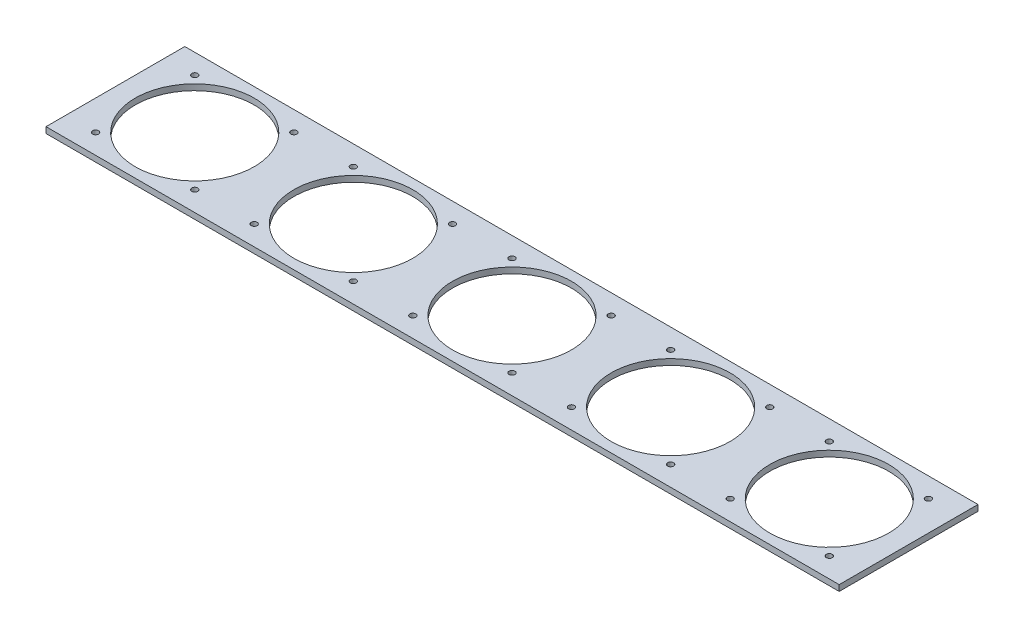
ISO-10303-21;
HEADER;
FILE_DESCRIPTION(('STEP AP214'),'2;1');
FILE_NAME('part.step','',(''),(''),'','','');
FILE_SCHEMA(('AUTOMOTIVE_DESIGN { 1 0 10303 214 1 1 1 1 }'));
ENDSEC;
DATA;
#1=APPLICATION_CONTEXT('core data for automotive mechanical design processes');
#2=APPLICATION_PROTOCOL_DEFINITION('international standard','automotive_design',2000,#1);
#3=PRODUCT_CONTEXT('',#1,'mechanical');
#4=PRODUCT('Part','Part','',(#3));
#5=PRODUCT_RELATED_PRODUCT_CATEGORY('part','',(#4));
#6=PRODUCT_DEFINITION_FORMATION('','',#4);
#7=PRODUCT_DEFINITION_CONTEXT('part definition',#1,'design');
#8=PRODUCT_DEFINITION('design','',#6,#7);
#9=PRODUCT_DEFINITION_SHAPE('','',#8);
#10=(LENGTH_UNIT() NAMED_UNIT(*) SI_UNIT(.MILLI.,.METRE.));
#11=(NAMED_UNIT(*) PLANE_ANGLE_UNIT() SI_UNIT($,.RADIAN.));
#12=(NAMED_UNIT(*) SI_UNIT($,.STERADIAN.) SOLID_ANGLE_UNIT());
#13=UNCERTAINTY_MEASURE_WITH_UNIT(LENGTH_MEASURE(1.E-05),#10,'distance_accuracy_value','');
#14=(GEOMETRIC_REPRESENTATION_CONTEXT(3) GLOBAL_UNCERTAINTY_ASSIGNED_CONTEXT((#13)) GLOBAL_UNIT_ASSIGNED_CONTEXT((#10,
#11,#12)) REPRESENTATION_CONTEXT('',''));
#15=CARTESIAN_POINT('',(0.,0.,0.));
#16=DIRECTION('',(0.,0.,1.));
#17=DIRECTION('',(1.,0.,0.));
#18=AXIS2_PLACEMENT_3D('',#15,#16,#17);
#19=CARTESIAN_POINT('',(0.,3.,0.));
#20=DIRECTION('',(0.,-1.,0.));
#21=DIRECTION('',(0.,0.,-1.));
#22=AXIS2_PLACEMENT_3D('',#19,#20,#21);
#23=PLANE('',#22);
#24=CARTESIAN_POINT('',(385.,3.,-10.));
#25=DIRECTION('',(0.,1.,0.));
#26=DIRECTION('',(0.,0.,1.));
#27=AXIS2_PLACEMENT_3D('',#24,#25,#26);
#28=CIRCLE('',#27,1.50000000000002);
#29=CARTESIAN_POINT('',(385.,3.,-8.49999999999998));
#30=VERTEX_POINT('',#29);
#31=EDGE_CURVE('E246',#30,#30,#28,.T.);
#32=ORIENTED_EDGE('',*,*,#31,.F.);
#33=EDGE_LOOP('',(#32));
#34=FACE_BOUND('',#33,.T.);
#35=CARTESIAN_POINT('',(335.,3.,-60.));
#36=DIRECTION('',(0.,1.,0.));
#37=DIRECTION('',(0.,0.,1.));
#38=AXIS2_PLACEMENT_3D('',#35,#36,#37);
#39=CIRCLE('',#38,1.50000000000002);
#40=CARTESIAN_POINT('',(335.,3.,-58.5));
#41=VERTEX_POINT('',#40);
#42=EDGE_CURVE('E234',#41,#41,#39,.T.);
#43=ORIENTED_EDGE('',*,*,#42,.F.);
#44=EDGE_LOOP('',(#43));
#45=FACE_BOUND('',#44,.T.);
#46=CARTESIAN_POINT('',(305.,3.,-10.));
#47=DIRECTION('',(0.,1.,0.));
#48=DIRECTION('',(0.,0.,1.));
#49=AXIS2_PLACEMENT_3D('',#46,#47,#48);
#50=CIRCLE('',#49,1.49999999999997);
#51=CARTESIAN_POINT('',(305.,3.,-8.50000000000003));
#52=VERTEX_POINT('',#51);
#53=EDGE_CURVE('E222',#52,#52,#50,.T.);
#54=ORIENTED_EDGE('',*,*,#53,.F.);
#55=EDGE_LOOP('',(#54));
#56=FACE_BOUND('',#55,.T.);
#57=CARTESIAN_POINT('',(255.,3.,-60.));
#58=DIRECTION('',(0.,1.,0.));
#59=DIRECTION('',(0.,0.,1.));
#60=AXIS2_PLACEMENT_3D('',#57,#58,#59);
#61=CIRCLE('',#60,1.50000000000002);
#62=CARTESIAN_POINT('',(255.,3.,-58.5));
#63=VERTEX_POINT('',#62);
#64=EDGE_CURVE('E210',#63,#63,#61,.T.);
#65=ORIENTED_EDGE('',*,*,#64,.F.);
#66=EDGE_LOOP('',(#65));
#67=FACE_BOUND('',#66,.T.);
#68=CARTESIAN_POINT('',(225.,3.,-10.));
#69=DIRECTION('',(0.,1.,0.));
#70=DIRECTION('',(0.,0.,1.));
#71=AXIS2_PLACEMENT_3D('',#68,#69,#70);
#72=CIRCLE('',#71,1.5);
#73=CARTESIAN_POINT('',(225.,3.,-8.5));
#74=VERTEX_POINT('',#73);
#75=EDGE_CURVE('E198',#74,#74,#72,.T.);
#76=ORIENTED_EDGE('',*,*,#75,.F.);
#77=EDGE_LOOP('',(#76));
#78=FACE_BOUND('',#77,.T.);
#79=CARTESIAN_POINT('',(175.,3.,-60.));
#80=DIRECTION('',(0.,1.,0.));
#81=DIRECTION('',(0.,0.,1.));
#82=AXIS2_PLACEMENT_3D('',#79,#80,#81);
#83=CIRCLE('',#82,1.5);
#84=CARTESIAN_POINT('',(175.,3.,-58.5));
#85=VERTEX_POINT('',#84);
#86=EDGE_CURVE('E186',#85,#85,#83,.T.);
#87=ORIENTED_EDGE('',*,*,#86,.F.);
#88=EDGE_LOOP('',(#87));
#89=FACE_BOUND('',#88,.T.);
#90=CARTESIAN_POINT('',(145.,3.,-10.));
#91=DIRECTION('',(0.,1.,0.));
#92=DIRECTION('',(0.,0.,1.));
#93=AXIS2_PLACEMENT_3D('',#90,#91,#92);
#94=CIRCLE('',#93,1.50000000000002);
#95=CARTESIAN_POINT('',(145.,3.,-8.49999999999998));
#96=VERTEX_POINT('',#95);
#97=EDGE_CURVE('E174',#96,#96,#94,.T.);
#98=ORIENTED_EDGE('',*,*,#97,.F.);
#99=EDGE_LOOP('',(#98));
#100=FACE_BOUND('',#99,.T.);
#101=CARTESIAN_POINT('',(95.,3.,-60.));
#102=DIRECTION('',(0.,1.,0.));
#103=DIRECTION('',(0.,0.,1.));
#104=AXIS2_PLACEMENT_3D('',#101,#102,#103);
#105=CIRCLE('',#104,1.50000000000001);
#106=CARTESIAN_POINT('',(95.,3.,-58.5));
#107=VERTEX_POINT('',#106);
#108=EDGE_CURVE('E162',#107,#107,#105,.T.);
#109=ORIENTED_EDGE('',*,*,#108,.F.);
#110=EDGE_LOOP('',(#109));
#111=FACE_BOUND('',#110,.T.);
#112=CARTESIAN_POINT('',(65.,3.,-10.));
#113=DIRECTION('',(0.,1.,0.));
#114=DIRECTION('',(0.,0.,1.));
#115=AXIS2_PLACEMENT_3D('',#112,#113,#114);
#116=CIRCLE('',#115,1.5);
#117=CARTESIAN_POINT('',(65.,3.,-8.5));
#118=VERTEX_POINT('',#117);
#119=EDGE_CURVE('E150',#118,#118,#116,.T.);
#120=ORIENTED_EDGE('',*,*,#119,.F.);
#121=EDGE_LOOP('',(#120));
#122=FACE_BOUND('',#121,.T.);
#123=CARTESIAN_POINT('',(360.,3.,-35.));
#124=DIRECTION('',(0.,1.,0.));
#125=DIRECTION('',(0.,0.,1.));
#126=AXIS2_PLACEMENT_3D('',#123,#124,#125);
#127=CIRCLE('',#126,30.);
#128=CARTESIAN_POINT('',(360.,3.,-4.99999999999995));
#129=VERTEX_POINT('',#128);
#130=EDGE_CURVE('E138',#129,#129,#127,.T.);
#131=ORIENTED_EDGE('',*,*,#130,.F.);
#132=EDGE_LOOP('',(#131));
#133=FACE_BOUND('',#132,.T.);
#134=CARTESIAN_POINT('',(200.,3.,-35.));
#135=DIRECTION('',(0.,1.,0.));
#136=DIRECTION('',(0.,0.,1.));
#137=AXIS2_PLACEMENT_3D('',#134,#135,#136);
#138=CIRCLE('',#137,30.);
#139=CARTESIAN_POINT('',(200.,3.,-5.));
#140=VERTEX_POINT('',#139);
#141=EDGE_CURVE('E126',#140,#140,#138,.T.);
#142=ORIENTED_EDGE('',*,*,#141,.F.);
#143=EDGE_LOOP('',(#142));
#144=FACE_BOUND('',#143,.T.);
#145=CARTESIAN_POINT('',(15.,3.,-60.));
#146=DIRECTION('',(0.,1.,0.));
#147=DIRECTION('',(0.,0.,1.));
#148=AXIS2_PLACEMENT_3D('',#145,#146,#147);
#149=CIRCLE('',#148,1.5);
#150=CARTESIAN_POINT('',(15.,3.,-58.5));
#151=VERTEX_POINT('',#150);
#152=EDGE_CURVE('E114',#151,#151,#149,.T.);
#153=ORIENTED_EDGE('',*,*,#152,.F.);
#154=EDGE_LOOP('',(#153));
#155=FACE_BOUND('',#154,.T.);
#156=DIRECTION('',(0.,0.,1.));
#157=VECTOR('',#156,1.);
#158=CARTESIAN_POINT('',(0.,3.,0.));
#159=LINE('',#158,#157);
#160=CARTESIAN_POINT('',(0.,3.,-70.));
#161=VERTEX_POINT('',#160);
#162=CARTESIAN_POINT('',(0.,3.,0.));
#163=VERTEX_POINT('',#162);
#164=EDGE_CURVE('E84',#161,#163,#159,.T.);
#165=ORIENTED_EDGE('',*,*,#164,.T.);
#166=DIRECTION('',(1.,0.,0.));
#167=VECTOR('',#166,1.);
#168=CARTESIAN_POINT('',(0.,3.,0.));
#169=LINE('',#168,#167);
#170=CARTESIAN_POINT('',(400.,3.,0.));
#171=VERTEX_POINT('',#170);
#172=EDGE_CURVE('E79',#163,#171,#169,.T.);
#173=ORIENTED_EDGE('',*,*,#172,.T.);
#174=DIRECTION('',(0.,0.,-1.));
#175=VECTOR('',#174,1.);
#176=CARTESIAN_POINT('',(400.,3.,0.));
#177=LINE('',#176,#175);
#178=CARTESIAN_POINT('',(400.,3.,-70.));
#179=VERTEX_POINT('',#178);
#180=EDGE_CURVE('E82',#171,#179,#177,.T.);
#181=ORIENTED_EDGE('',*,*,#180,.T.);
#182=DIRECTION('',(-1.,0.,0.));
#183=VECTOR('',#182,1.);
#184=CARTESIAN_POINT('',(0.,3.,-70.));
#185=LINE('',#184,#183);
#186=EDGE_CURVE('E49',#179,#161,#185,.T.);
#187=ORIENTED_EDGE('',*,*,#186,.T.);
#188=EDGE_LOOP('',(#165,#173,#181,#187));
#189=FACE_BOUND('',#188,.T.);
#190=CARTESIAN_POINT('',(40.,3.,-35.));
#191=DIRECTION('',(0.,1.,0.));
#192=DIRECTION('',(0.,0.,1.));
#193=AXIS2_PLACEMENT_3D('',#190,#191,#192);
#194=CIRCLE('',#193,30.);
#195=CARTESIAN_POINT('',(40.,3.,-5.));
#196=VERTEX_POINT('',#195);
#197=EDGE_CURVE('E99',#196,#196,#194,.T.);
#198=ORIENTED_EDGE('',*,*,#197,.F.);
#199=EDGE_LOOP('',(#198));
#200=FACE_BOUND('',#199,.T.);
#201=CARTESIAN_POINT('',(120.,3.,-35.));
#202=DIRECTION('',(0.,1.,0.));
#203=DIRECTION('',(0.,0.,1.));
#204=AXIS2_PLACEMENT_3D('',#201,#202,#203);
#205=CIRCLE('',#204,30.);
#206=CARTESIAN_POINT('',(120.,3.,-5.));
#207=VERTEX_POINT('',#206);
#208=EDGE_CURVE('E120',#207,#207,#205,.T.);
#209=ORIENTED_EDGE('',*,*,#208,.F.);
#210=EDGE_LOOP('',(#209));
#211=FACE_BOUND('',#210,.T.);
#212=CARTESIAN_POINT('',(280.,3.,-35.));
#213=DIRECTION('',(0.,1.,0.));
#214=DIRECTION('',(0.,0.,1.));
#215=AXIS2_PLACEMENT_3D('',#212,#213,#214);
#216=CIRCLE('',#215,30.);
#217=CARTESIAN_POINT('',(280.,3.,-5.));
#218=VERTEX_POINT('',#217);
#219=EDGE_CURVE('E132',#218,#218,#216,.T.);
#220=ORIENTED_EDGE('',*,*,#219,.F.);
#221=EDGE_LOOP('',(#220));
#222=FACE_BOUND('',#221,.T.);
#223=CARTESIAN_POINT('',(65.,3.,-60.));
#224=DIRECTION('',(0.,1.,0.));
#225=DIRECTION('',(0.,0.,1.));
#226=AXIS2_PLACEMENT_3D('',#223,#224,#225);
#227=CIRCLE('',#226,1.5);
#228=CARTESIAN_POINT('',(65.,3.,-58.5));
#229=VERTEX_POINT('',#228);
#230=EDGE_CURVE('E144',#229,#229,#227,.T.);
#231=ORIENTED_EDGE('',*,*,#230,.F.);
#232=EDGE_LOOP('',(#231));
#233=FACE_BOUND('',#232,.T.);
#234=CARTESIAN_POINT('',(15.,3.,-10.));
#235=DIRECTION('',(0.,1.,0.));
#236=DIRECTION('',(0.,0.,1.));
#237=AXIS2_PLACEMENT_3D('',#234,#235,#236);
#238=CIRCLE('',#237,1.5);
#239=CARTESIAN_POINT('',(15.,3.,-8.5));
#240=VERTEX_POINT('',#239);
#241=EDGE_CURVE('E156',#240,#240,#238,.T.);
#242=ORIENTED_EDGE('',*,*,#241,.F.);
#243=EDGE_LOOP('',(#242));
#244=FACE_BOUND('',#243,.T.);
#245=CARTESIAN_POINT('',(145.,3.,-60.));
#246=DIRECTION('',(0.,1.,0.));
#247=DIRECTION('',(0.,0.,1.));
#248=AXIS2_PLACEMENT_3D('',#245,#246,#247);
#249=CIRCLE('',#248,1.50000000000002);
#250=CARTESIAN_POINT('',(145.,3.,-58.5));
#251=VERTEX_POINT('',#250);
#252=EDGE_CURVE('E168',#251,#251,#249,.T.);
#253=ORIENTED_EDGE('',*,*,#252,.F.);
#254=EDGE_LOOP('',(#253));
#255=FACE_BOUND('',#254,.T.);
#256=CARTESIAN_POINT('',(95.,3.,-10.));
#257=DIRECTION('',(0.,1.,0.));
#258=DIRECTION('',(0.,0.,1.));
#259=AXIS2_PLACEMENT_3D('',#256,#257,#258);
#260=CIRCLE('',#259,1.50000000000001);
#261=CARTESIAN_POINT('',(95.,3.,-8.49999999999999));
#262=VERTEX_POINT('',#261);
#263=EDGE_CURVE('E180',#262,#262,#260,.T.);
#264=ORIENTED_EDGE('',*,*,#263,.F.);
#265=EDGE_LOOP('',(#264));
#266=FACE_BOUND('',#265,.T.);
#267=CARTESIAN_POINT('',(225.,3.,-60.));
#268=DIRECTION('',(0.,1.,0.));
#269=DIRECTION('',(0.,0.,1.));
#270=AXIS2_PLACEMENT_3D('',#267,#268,#269);
#271=CIRCLE('',#270,1.5);
#272=CARTESIAN_POINT('',(225.,3.,-58.5));
#273=VERTEX_POINT('',#272);
#274=EDGE_CURVE('E192',#273,#273,#271,.T.);
#275=ORIENTED_EDGE('',*,*,#274,.F.);
#276=EDGE_LOOP('',(#275));
#277=FACE_BOUND('',#276,.T.);
#278=CARTESIAN_POINT('',(175.,3.,-10.));
#279=DIRECTION('',(0.,1.,0.));
#280=DIRECTION('',(0.,0.,1.));
#281=AXIS2_PLACEMENT_3D('',#278,#279,#280);
#282=CIRCLE('',#281,1.5);
#283=CARTESIAN_POINT('',(175.,3.,-8.5));
#284=VERTEX_POINT('',#283);
#285=EDGE_CURVE('E204',#284,#284,#282,.T.);
#286=ORIENTED_EDGE('',*,*,#285,.F.);
#287=EDGE_LOOP('',(#286));
#288=FACE_BOUND('',#287,.T.);
#289=CARTESIAN_POINT('',(305.,3.,-60.));
#290=DIRECTION('',(0.,1.,0.));
#291=DIRECTION('',(0.,0.,1.));
#292=AXIS2_PLACEMENT_3D('',#289,#290,#291);
#293=CIRCLE('',#292,1.49999999999997);
#294=CARTESIAN_POINT('',(305.,3.,-58.5));
#295=VERTEX_POINT('',#294);
#296=EDGE_CURVE('E216',#295,#295,#293,.T.);
#297=ORIENTED_EDGE('',*,*,#296,.F.);
#298=EDGE_LOOP('',(#297));
#299=FACE_BOUND('',#298,.T.);
#300=CARTESIAN_POINT('',(255.,3.,-10.));
#301=DIRECTION('',(0.,1.,0.));
#302=DIRECTION('',(0.,0.,1.));
#303=AXIS2_PLACEMENT_3D('',#300,#301,#302);
#304=CIRCLE('',#303,1.50000000000002);
#305=CARTESIAN_POINT('',(255.,3.,-8.49999999999998));
#306=VERTEX_POINT('',#305);
#307=EDGE_CURVE('E228',#306,#306,#304,.T.);
#308=ORIENTED_EDGE('',*,*,#307,.F.);
#309=EDGE_LOOP('',(#308));
#310=FACE_BOUND('',#309,.T.);
#311=CARTESIAN_POINT('',(385.,3.,-60.));
#312=DIRECTION('',(0.,1.,0.));
#313=DIRECTION('',(0.,0.,1.));
#314=AXIS2_PLACEMENT_3D('',#311,#312,#313);
#315=CIRCLE('',#314,1.50000000000002);
#316=CARTESIAN_POINT('',(385.,3.,-58.5));
#317=VERTEX_POINT('',#316);
#318=EDGE_CURVE('E240',#317,#317,#315,.T.);
#319=ORIENTED_EDGE('',*,*,#318,.F.);
#320=EDGE_LOOP('',(#319));
#321=FACE_BOUND('',#320,.T.);
#322=CARTESIAN_POINT('',(335.,3.,-10.));
#323=DIRECTION('',(0.,1.,0.));
#324=DIRECTION('',(0.,0.,1.));
#325=AXIS2_PLACEMENT_3D('',#322,#323,#324);
#326=CIRCLE('',#325,1.50000000000002);
#327=CARTESIAN_POINT('',(335.,3.,-8.49999999999998));
#328=VERTEX_POINT('',#327);
#329=EDGE_CURVE('E252',#328,#328,#326,.T.);
#330=ORIENTED_EDGE('',*,*,#329,.F.);
#331=EDGE_LOOP('',(#330));
#332=FACE_BOUND('',#331,.T.);
#333=ADVANCED_FACE('F32',(#34,#45,#56,#67,#78,#89,#100,#111,#122,#133,#144,#155,#189,#200,#211,
#222,#233,#244,#255,#266,#277,#288,#299,#310,#321,#332),#23,.F.);
#334=CARTESIAN_POINT('',(0.,0.,0.));
#335=DIRECTION('',(0.,-1.,0.));
#336=DIRECTION('',(0.,0.,-1.));
#337=AXIS2_PLACEMENT_3D('',#334,#335,#336);
#338=PLANE('',#337);
#339=CARTESIAN_POINT('',(385.,0.,-10.));
#340=DIRECTION('',(0.,1.,0.));
#341=DIRECTION('',(0.,0.,1.));
#342=AXIS2_PLACEMENT_3D('',#339,#340,#341);
#343=CIRCLE('',#342,1.50000000000002);
#344=CARTESIAN_POINT('',(385.,0.,-8.49999999999998));
#345=VERTEX_POINT('',#344);
#346=EDGE_CURVE('E249',#345,#345,#343,.T.);
#347=ORIENTED_EDGE('',*,*,#346,.T.);
#348=EDGE_LOOP('',(#347));
#349=FACE_BOUND('',#348,.T.);
#350=CARTESIAN_POINT('',(335.,0.,-60.));
#351=DIRECTION('',(0.,1.,0.));
#352=DIRECTION('',(0.,0.,1.));
#353=AXIS2_PLACEMENT_3D('',#350,#351,#352);
#354=CIRCLE('',#353,1.50000000000002);
#355=CARTESIAN_POINT('',(335.,0.,-58.5));
#356=VERTEX_POINT('',#355);
#357=EDGE_CURVE('E237',#356,#356,#354,.T.);
#358=ORIENTED_EDGE('',*,*,#357,.T.);
#359=EDGE_LOOP('',(#358));
#360=FACE_BOUND('',#359,.T.);
#361=CARTESIAN_POINT('',(305.,0.,-10.));
#362=DIRECTION('',(0.,1.,0.));
#363=DIRECTION('',(0.,0.,1.));
#364=AXIS2_PLACEMENT_3D('',#361,#362,#363);
#365=CIRCLE('',#364,1.49999999999997);
#366=CARTESIAN_POINT('',(305.,0.,-8.50000000000003));
#367=VERTEX_POINT('',#366);
#368=EDGE_CURVE('E225',#367,#367,#365,.T.);
#369=ORIENTED_EDGE('',*,*,#368,.T.);
#370=EDGE_LOOP('',(#369));
#371=FACE_BOUND('',#370,.T.);
#372=CARTESIAN_POINT('',(255.,0.,-60.));
#373=DIRECTION('',(0.,1.,0.));
#374=DIRECTION('',(0.,0.,1.));
#375=AXIS2_PLACEMENT_3D('',#372,#373,#374);
#376=CIRCLE('',#375,1.50000000000002);
#377=CARTESIAN_POINT('',(255.,0.,-58.5));
#378=VERTEX_POINT('',#377);
#379=EDGE_CURVE('E213',#378,#378,#376,.T.);
#380=ORIENTED_EDGE('',*,*,#379,.T.);
#381=EDGE_LOOP('',(#380));
#382=FACE_BOUND('',#381,.T.);
#383=CARTESIAN_POINT('',(225.,0.,-10.));
#384=DIRECTION('',(0.,1.,0.));
#385=DIRECTION('',(0.,0.,1.));
#386=AXIS2_PLACEMENT_3D('',#383,#384,#385);
#387=CIRCLE('',#386,1.5);
#388=CARTESIAN_POINT('',(225.,0.,-8.5));
#389=VERTEX_POINT('',#388);
#390=EDGE_CURVE('E201',#389,#389,#387,.T.);
#391=ORIENTED_EDGE('',*,*,#390,.T.);
#392=EDGE_LOOP('',(#391));
#393=FACE_BOUND('',#392,.T.);
#394=CARTESIAN_POINT('',(175.,0.,-60.));
#395=DIRECTION('',(0.,1.,0.));
#396=DIRECTION('',(0.,0.,1.));
#397=AXIS2_PLACEMENT_3D('',#394,#395,#396);
#398=CIRCLE('',#397,1.5);
#399=CARTESIAN_POINT('',(175.,0.,-58.5));
#400=VERTEX_POINT('',#399);
#401=EDGE_CURVE('E189',#400,#400,#398,.T.);
#402=ORIENTED_EDGE('',*,*,#401,.T.);
#403=EDGE_LOOP('',(#402));
#404=FACE_BOUND('',#403,.T.);
#405=CARTESIAN_POINT('',(145.,0.,-10.));
#406=DIRECTION('',(0.,1.,0.));
#407=DIRECTION('',(0.,0.,1.));
#408=AXIS2_PLACEMENT_3D('',#405,#406,#407);
#409=CIRCLE('',#408,1.50000000000002);
#410=CARTESIAN_POINT('',(145.,0.,-8.49999999999998));
#411=VERTEX_POINT('',#410);
#412=EDGE_CURVE('E177',#411,#411,#409,.T.);
#413=ORIENTED_EDGE('',*,*,#412,.T.);
#414=EDGE_LOOP('',(#413));
#415=FACE_BOUND('',#414,.T.);
#416=CARTESIAN_POINT('',(95.,0.,-60.));
#417=DIRECTION('',(0.,1.,0.));
#418=DIRECTION('',(0.,0.,1.));
#419=AXIS2_PLACEMENT_3D('',#416,#417,#418);
#420=CIRCLE('',#419,1.50000000000001);
#421=CARTESIAN_POINT('',(95.,0.,-58.5));
#422=VERTEX_POINT('',#421);
#423=EDGE_CURVE('E165',#422,#422,#420,.T.);
#424=ORIENTED_EDGE('',*,*,#423,.T.);
#425=EDGE_LOOP('',(#424));
#426=FACE_BOUND('',#425,.T.);
#427=CARTESIAN_POINT('',(65.,0.,-10.));
#428=DIRECTION('',(0.,1.,0.));
#429=DIRECTION('',(0.,0.,1.));
#430=AXIS2_PLACEMENT_3D('',#427,#428,#429);
#431=CIRCLE('',#430,1.5);
#432=CARTESIAN_POINT('',(65.,0.,-8.5));
#433=VERTEX_POINT('',#432);
#434=EDGE_CURVE('E153',#433,#433,#431,.T.);
#435=ORIENTED_EDGE('',*,*,#434,.T.);
#436=EDGE_LOOP('',(#435));
#437=FACE_BOUND('',#436,.T.);
#438=CARTESIAN_POINT('',(360.,0.,-35.));
#439=DIRECTION('',(0.,1.,0.));
#440=DIRECTION('',(0.,0.,1.));
#441=AXIS2_PLACEMENT_3D('',#438,#439,#440);
#442=CIRCLE('',#441,30.);
#443=CARTESIAN_POINT('',(360.,0.,-4.99999999999995));
#444=VERTEX_POINT('',#443);
#445=EDGE_CURVE('E141',#444,#444,#442,.T.);
#446=ORIENTED_EDGE('',*,*,#445,.T.);
#447=EDGE_LOOP('',(#446));
#448=FACE_BOUND('',#447,.T.);
#449=CARTESIAN_POINT('',(200.,0.,-35.));
#450=DIRECTION('',(0.,1.,0.));
#451=DIRECTION('',(0.,0.,1.));
#452=AXIS2_PLACEMENT_3D('',#449,#450,#451);
#453=CIRCLE('',#452,30.);
#454=CARTESIAN_POINT('',(200.,0.,-5.));
#455=VERTEX_POINT('',#454);
#456=EDGE_CURVE('E129',#455,#455,#453,.T.);
#457=ORIENTED_EDGE('',*,*,#456,.T.);
#458=EDGE_LOOP('',(#457));
#459=FACE_BOUND('',#458,.T.);
#460=CARTESIAN_POINT('',(15.,0.,-60.));
#461=DIRECTION('',(0.,1.,0.));
#462=DIRECTION('',(0.,0.,1.));
#463=AXIS2_PLACEMENT_3D('',#460,#461,#462);
#464=CIRCLE('',#463,1.5);
#465=CARTESIAN_POINT('',(15.,0.,-58.5));
#466=VERTEX_POINT('',#465);
#467=EDGE_CURVE('E117',#466,#466,#464,.T.);
#468=ORIENTED_EDGE('',*,*,#467,.T.);
#469=EDGE_LOOP('',(#468));
#470=FACE_BOUND('',#469,.T.);
#471=DIRECTION('',(0.,0.,1.));
#472=VECTOR('',#471,1.);
#473=CARTESIAN_POINT('',(0.,0.,0.));
#474=LINE('',#473,#472);
#475=CARTESIAN_POINT('',(0.,0.,-70.));
#476=VERTEX_POINT('',#475);
#477=CARTESIAN_POINT('',(0.,0.,0.));
#478=VERTEX_POINT('',#477);
#479=EDGE_CURVE('E96',#476,#478,#474,.T.);
#480=ORIENTED_EDGE('',*,*,#479,.F.);
#481=DIRECTION('',(-1.,0.,0.));
#482=VECTOR('',#481,1.);
#483=CARTESIAN_POINT('',(0.,0.,-70.));
#484=LINE('',#483,#482);
#485=CARTESIAN_POINT('',(400.,0.,-70.));
#486=VERTEX_POINT('',#485);
#487=EDGE_CURVE('E72',#486,#476,#484,.T.);
#488=ORIENTED_EDGE('',*,*,#487,.F.);
#489=DIRECTION('',(0.,0.,-1.));
#490=VECTOR('',#489,1.);
#491=CARTESIAN_POINT('',(400.,0.,0.));
#492=LINE('',#491,#490);
#493=CARTESIAN_POINT('',(400.,0.,0.));
#494=VERTEX_POINT('',#493);
#495=EDGE_CURVE('E66',#494,#486,#492,.T.);
#496=ORIENTED_EDGE('',*,*,#495,.F.);
#497=DIRECTION('',(1.,0.,0.));
#498=VECTOR('',#497,1.);
#499=CARTESIAN_POINT('',(0.,0.,0.));
#500=LINE('',#499,#498);
#501=EDGE_CURVE('E88',#478,#494,#500,.T.);
#502=ORIENTED_EDGE('',*,*,#501,.F.);
#503=EDGE_LOOP('',(#480,#488,#496,#502));
#504=FACE_BOUND('',#503,.T.);
#505=CARTESIAN_POINT('',(40.,0.,-35.));
#506=DIRECTION('',(0.,1.,0.));
#507=DIRECTION('',(0.,0.,1.));
#508=AXIS2_PLACEMENT_3D('',#505,#506,#507);
#509=CIRCLE('',#508,30.);
#510=CARTESIAN_POINT('',(40.,0.,-5.));
#511=VERTEX_POINT('',#510);
#512=EDGE_CURVE('E111',#511,#511,#509,.T.);
#513=ORIENTED_EDGE('',*,*,#512,.T.);
#514=EDGE_LOOP('',(#513));
#515=FACE_BOUND('',#514,.T.);
#516=CARTESIAN_POINT('',(120.,0.,-35.));
#517=DIRECTION('',(0.,1.,0.));
#518=DIRECTION('',(0.,0.,1.));
#519=AXIS2_PLACEMENT_3D('',#516,#517,#518);
#520=CIRCLE('',#519,30.);
#521=CARTESIAN_POINT('',(120.,0.,-5.));
#522=VERTEX_POINT('',#521);
#523=EDGE_CURVE('E123',#522,#522,#520,.T.);
#524=ORIENTED_EDGE('',*,*,#523,.T.);
#525=EDGE_LOOP('',(#524));
#526=FACE_BOUND('',#525,.T.);
#527=CARTESIAN_POINT('',(280.,0.,-35.));
#528=DIRECTION('',(0.,1.,0.));
#529=DIRECTION('',(0.,0.,1.));
#530=AXIS2_PLACEMENT_3D('',#527,#528,#529);
#531=CIRCLE('',#530,30.);
#532=CARTESIAN_POINT('',(280.,0.,-5.));
#533=VERTEX_POINT('',#532);
#534=EDGE_CURVE('E135',#533,#533,#531,.T.);
#535=ORIENTED_EDGE('',*,*,#534,.T.);
#536=EDGE_LOOP('',(#535));
#537=FACE_BOUND('',#536,.T.);
#538=CARTESIAN_POINT('',(65.,0.,-60.));
#539=DIRECTION('',(0.,1.,0.));
#540=DIRECTION('',(0.,0.,1.));
#541=AXIS2_PLACEMENT_3D('',#538,#539,#540);
#542=CIRCLE('',#541,1.5);
#543=CARTESIAN_POINT('',(65.,0.,-58.5));
#544=VERTEX_POINT('',#543);
#545=EDGE_CURVE('E147',#544,#544,#542,.T.);
#546=ORIENTED_EDGE('',*,*,#545,.T.);
#547=EDGE_LOOP('',(#546));
#548=FACE_BOUND('',#547,.T.);
#549=CARTESIAN_POINT('',(15.,0.,-10.));
#550=DIRECTION('',(0.,1.,0.));
#551=DIRECTION('',(0.,0.,1.));
#552=AXIS2_PLACEMENT_3D('',#549,#550,#551);
#553=CIRCLE('',#552,1.5);
#554=CARTESIAN_POINT('',(15.,0.,-8.5));
#555=VERTEX_POINT('',#554);
#556=EDGE_CURVE('E159',#555,#555,#553,.T.);
#557=ORIENTED_EDGE('',*,*,#556,.T.);
#558=EDGE_LOOP('',(#557));
#559=FACE_BOUND('',#558,.T.);
#560=CARTESIAN_POINT('',(145.,0.,-60.));
#561=DIRECTION('',(0.,1.,0.));
#562=DIRECTION('',(0.,0.,1.));
#563=AXIS2_PLACEMENT_3D('',#560,#561,#562);
#564=CIRCLE('',#563,1.50000000000002);
#565=CARTESIAN_POINT('',(145.,0.,-58.5));
#566=VERTEX_POINT('',#565);
#567=EDGE_CURVE('E171',#566,#566,#564,.T.);
#568=ORIENTED_EDGE('',*,*,#567,.T.);
#569=EDGE_LOOP('',(#568));
#570=FACE_BOUND('',#569,.T.);
#571=CARTESIAN_POINT('',(95.,0.,-10.));
#572=DIRECTION('',(0.,1.,0.));
#573=DIRECTION('',(0.,0.,1.));
#574=AXIS2_PLACEMENT_3D('',#571,#572,#573);
#575=CIRCLE('',#574,1.50000000000001);
#576=CARTESIAN_POINT('',(95.,0.,-8.49999999999999));
#577=VERTEX_POINT('',#576);
#578=EDGE_CURVE('E183',#577,#577,#575,.T.);
#579=ORIENTED_EDGE('',*,*,#578,.T.);
#580=EDGE_LOOP('',(#579));
#581=FACE_BOUND('',#580,.T.);
#582=CARTESIAN_POINT('',(225.,0.,-60.));
#583=DIRECTION('',(0.,1.,0.));
#584=DIRECTION('',(0.,0.,1.));
#585=AXIS2_PLACEMENT_3D('',#582,#583,#584);
#586=CIRCLE('',#585,1.5);
#587=CARTESIAN_POINT('',(225.,0.,-58.5));
#588=VERTEX_POINT('',#587);
#589=EDGE_CURVE('E195',#588,#588,#586,.T.);
#590=ORIENTED_EDGE('',*,*,#589,.T.);
#591=EDGE_LOOP('',(#590));
#592=FACE_BOUND('',#591,.T.);
#593=CARTESIAN_POINT('',(175.,0.,-10.));
#594=DIRECTION('',(0.,1.,0.));
#595=DIRECTION('',(0.,0.,1.));
#596=AXIS2_PLACEMENT_3D('',#593,#594,#595);
#597=CIRCLE('',#596,1.5);
#598=CARTESIAN_POINT('',(175.,0.,-8.5));
#599=VERTEX_POINT('',#598);
#600=EDGE_CURVE('E207',#599,#599,#597,.T.);
#601=ORIENTED_EDGE('',*,*,#600,.T.);
#602=EDGE_LOOP('',(#601));
#603=FACE_BOUND('',#602,.T.);
#604=CARTESIAN_POINT('',(305.,0.,-60.));
#605=DIRECTION('',(0.,1.,0.));
#606=DIRECTION('',(0.,0.,1.));
#607=AXIS2_PLACEMENT_3D('',#604,#605,#606);
#608=CIRCLE('',#607,1.49999999999997);
#609=CARTESIAN_POINT('',(305.,0.,-58.5));
#610=VERTEX_POINT('',#609);
#611=EDGE_CURVE('E219',#610,#610,#608,.T.);
#612=ORIENTED_EDGE('',*,*,#611,.T.);
#613=EDGE_LOOP('',(#612));
#614=FACE_BOUND('',#613,.T.);
#615=CARTESIAN_POINT('',(255.,0.,-10.));
#616=DIRECTION('',(0.,1.,0.));
#617=DIRECTION('',(0.,0.,1.));
#618=AXIS2_PLACEMENT_3D('',#615,#616,#617);
#619=CIRCLE('',#618,1.50000000000002);
#620=CARTESIAN_POINT('',(255.,0.,-8.49999999999998));
#621=VERTEX_POINT('',#620);
#622=EDGE_CURVE('E231',#621,#621,#619,.T.);
#623=ORIENTED_EDGE('',*,*,#622,.T.);
#624=EDGE_LOOP('',(#623));
#625=FACE_BOUND('',#624,.T.);
#626=CARTESIAN_POINT('',(385.,0.,-60.));
#627=DIRECTION('',(0.,1.,0.));
#628=DIRECTION('',(0.,0.,1.));
#629=AXIS2_PLACEMENT_3D('',#626,#627,#628);
#630=CIRCLE('',#629,1.50000000000002);
#631=CARTESIAN_POINT('',(385.,0.,-58.5));
#632=VERTEX_POINT('',#631);
#633=EDGE_CURVE('E243',#632,#632,#630,.T.);
#634=ORIENTED_EDGE('',*,*,#633,.T.);
#635=EDGE_LOOP('',(#634));
#636=FACE_BOUND('',#635,.T.);
#637=CARTESIAN_POINT('',(335.,0.,-10.));
#638=DIRECTION('',(0.,1.,0.));
#639=DIRECTION('',(0.,0.,1.));
#640=AXIS2_PLACEMENT_3D('',#637,#638,#639);
#641=CIRCLE('',#640,1.50000000000002);
#642=CARTESIAN_POINT('',(335.,0.,-8.49999999999998));
#643=VERTEX_POINT('',#642);
#644=EDGE_CURVE('E255',#643,#643,#641,.T.);
#645=ORIENTED_EDGE('',*,*,#644,.T.);
#646=EDGE_LOOP('',(#645));
#647=FACE_BOUND('',#646,.T.);
#648=ADVANCED_FACE('F107',(#349,#360,#371,#382,#393,#404,#415,#426,#437,#448,#459,#470,#504,
#515,#526,#537,#548,#559,#570,#581,#592,#603,#614,#625,#636,#647),#338,.T.);
#649=CARTESIAN_POINT('',(0.,3.,0.));
#650=DIRECTION('',(1.,0.,0.));
#651=DIRECTION('',(0.,0.,-1.));
#652=AXIS2_PLACEMENT_3D('',#649,#650,#651);
#653=PLANE('',#652);
#654=ORIENTED_EDGE('',*,*,#479,.T.);
#655=DIRECTION('',(0.,-1.,0.));
#656=VECTOR('',#655,1.);
#657=CARTESIAN_POINT('',(0.,3.,0.));
#658=LINE('',#657,#656);
#659=EDGE_CURVE('E11',#163,#478,#658,.T.);
#660=ORIENTED_EDGE('',*,*,#659,.F.);
#661=ORIENTED_EDGE('',*,*,#164,.F.);
#662=DIRECTION('',(0.,-1.,0.));
#663=VECTOR('',#662,1.);
#664=CARTESIAN_POINT('',(0.,3.,-70.));
#665=LINE('',#664,#663);
#666=EDGE_CURVE('E92',#161,#476,#665,.T.);
#667=ORIENTED_EDGE('',*,*,#666,.T.);
#668=EDGE_LOOP('',(#654,#660,#661,#667));
#669=FACE_BOUND('',#668,.T.);
#670=ADVANCED_FACE('F34',(#669),#653,.F.);
#671=CARTESIAN_POINT('',(0.,3.,0.));
#672=DIRECTION('',(0.,0.,-1.));
#673=DIRECTION('',(-1.,0.,0.));
#674=AXIS2_PLACEMENT_3D('',#671,#672,#673);
#675=PLANE('',#674);
#676=ORIENTED_EDGE('',*,*,#501,.T.);
#677=DIRECTION('',(0.,-1.,0.));
#678=VECTOR('',#677,1.);
#679=CARTESIAN_POINT('',(400.,3.,0.));
#680=LINE('',#679,#678);
#681=EDGE_CURVE('E41',#171,#494,#680,.T.);
#682=ORIENTED_EDGE('',*,*,#681,.F.);
#683=ORIENTED_EDGE('',*,*,#172,.F.);
#684=ORIENTED_EDGE('',*,*,#659,.T.);
#685=EDGE_LOOP('',(#676,#682,#683,#684));
#686=FACE_BOUND('',#685,.T.);
#687=ADVANCED_FACE('F87',(#686),#675,.F.);
#688=CARTESIAN_POINT('',(400.,3.,0.));
#689=DIRECTION('',(-1.,0.,0.));
#690=DIRECTION('',(0.,0.,1.));
#691=AXIS2_PLACEMENT_3D('',#688,#689,#690);
#692=PLANE('',#691);
#693=ORIENTED_EDGE('',*,*,#495,.T.);
#694=DIRECTION('',(0.,-1.,0.));
#695=VECTOR('',#694,1.);
#696=CARTESIAN_POINT('',(400.,3.,-70.));
#697=LINE('',#696,#695);
#698=EDGE_CURVE('E89',#179,#486,#697,.T.);
#699=ORIENTED_EDGE('',*,*,#698,.F.);
#700=ORIENTED_EDGE('',*,*,#180,.F.);
#701=ORIENTED_EDGE('',*,*,#681,.T.);
#702=EDGE_LOOP('',(#693,#699,#700,#701));
#703=FACE_BOUND('',#702,.T.);
#704=ADVANCED_FACE('F90',(#703),#692,.F.);
#705=CARTESIAN_POINT('',(0.,3.,-70.));
#706=DIRECTION('',(0.,0.,1.));
#707=DIRECTION('',(1.,0.,0.));
#708=AXIS2_PLACEMENT_3D('',#705,#706,#707);
#709=PLANE('',#708);
#710=ORIENTED_EDGE('',*,*,#487,.T.);
#711=ORIENTED_EDGE('',*,*,#666,.F.);
#712=ORIENTED_EDGE('',*,*,#186,.F.);
#713=ORIENTED_EDGE('',*,*,#698,.T.);
#714=EDGE_LOOP('',(#710,#711,#712,#713));
#715=FACE_BOUND('',#714,.T.);
#716=ADVANCED_FACE('F104',(#715),#709,.F.);
#717=CARTESIAN_POINT('',(40.,3.,-35.));
#718=DIRECTION('',(0.,-1.,0.));
#719=DIRECTION('',(0.,0.,-1.));
#720=AXIS2_PLACEMENT_3D('',#717,#718,#719);
#721=CYLINDRICAL_SURFACE('',#720,30.);
#722=ORIENTED_EDGE('',*,*,#197,.T.);
#723=EDGE_LOOP('',(#722));
#724=FACE_BOUND('',#723,.T.);
#725=ORIENTED_EDGE('',*,*,#512,.F.);
#726=EDGE_LOOP('',(#725));
#727=FACE_BOUND('',#726,.T.);
#728=ADVANCED_FACE('F275',(#724,#727),#721,.F.);
#729=CARTESIAN_POINT('',(15.,3.,-60.));
#730=DIRECTION('',(0.,-1.,0.));
#731=DIRECTION('',(0.,0.,-1.));
#732=AXIS2_PLACEMENT_3D('',#729,#730,#731);
#733=CYLINDRICAL_SURFACE('',#732,1.5);
#734=ORIENTED_EDGE('',*,*,#152,.T.);
#735=EDGE_LOOP('',(#734));
#736=FACE_BOUND('',#735,.T.);
#737=ORIENTED_EDGE('',*,*,#467,.F.);
#738=EDGE_LOOP('',(#737));
#739=FACE_BOUND('',#738,.T.);
#740=ADVANCED_FACE('F321',(#736,#739),#733,.F.);
#741=CARTESIAN_POINT('',(120.,3.,-35.));
#742=DIRECTION('',(0.,-1.,0.));
#743=DIRECTION('',(0.,0.,-1.));
#744=AXIS2_PLACEMENT_3D('',#741,#742,#743);
#745=CYLINDRICAL_SURFACE('',#744,30.);
#746=ORIENTED_EDGE('',*,*,#208,.T.);
#747=EDGE_LOOP('',(#746));
#748=FACE_BOUND('',#747,.T.);
#749=ORIENTED_EDGE('',*,*,#523,.F.);
#750=EDGE_LOOP('',(#749));
#751=FACE_BOUND('',#750,.T.);
#752=ADVANCED_FACE('F329',(#748,#751),#745,.F.);
#753=CARTESIAN_POINT('',(200.,3.,-35.));
#754=DIRECTION('',(0.,-1.,0.));
#755=DIRECTION('',(0.,0.,-1.));
#756=AXIS2_PLACEMENT_3D('',#753,#754,#755);
#757=CYLINDRICAL_SURFACE('',#756,30.);
#758=ORIENTED_EDGE('',*,*,#141,.T.);
#759=EDGE_LOOP('',(#758));
#760=FACE_BOUND('',#759,.T.);
#761=ORIENTED_EDGE('',*,*,#456,.F.);
#762=EDGE_LOOP('',(#761));
#763=FACE_BOUND('',#762,.T.);
#764=ADVANCED_FACE('F337',(#760,#763),#757,.F.);
#765=CARTESIAN_POINT('',(280.,3.,-35.));
#766=DIRECTION('',(0.,-1.,0.));
#767=DIRECTION('',(0.,0.,-1.));
#768=AXIS2_PLACEMENT_3D('',#765,#766,#767);
#769=CYLINDRICAL_SURFACE('',#768,30.);
#770=ORIENTED_EDGE('',*,*,#219,.T.);
#771=EDGE_LOOP('',(#770));
#772=FACE_BOUND('',#771,.T.);
#773=ORIENTED_EDGE('',*,*,#534,.F.);
#774=EDGE_LOOP('',(#773));
#775=FACE_BOUND('',#774,.T.);
#776=ADVANCED_FACE('F346',(#772,#775),#769,.F.);
#777=CARTESIAN_POINT('',(360.,3.,-35.));
#778=DIRECTION('',(0.,-1.,0.));
#779=DIRECTION('',(0.,0.,-1.));
#780=AXIS2_PLACEMENT_3D('',#777,#778,#779);
#781=CYLINDRICAL_SURFACE('',#780,30.);
#782=ORIENTED_EDGE('',*,*,#130,.T.);
#783=EDGE_LOOP('',(#782));
#784=FACE_BOUND('',#783,.T.);
#785=ORIENTED_EDGE('',*,*,#445,.F.);
#786=EDGE_LOOP('',(#785));
#787=FACE_BOUND('',#786,.T.);
#788=ADVANCED_FACE('F355',(#784,#787),#781,.F.);
#789=CARTESIAN_POINT('',(65.,3.,-60.));
#790=DIRECTION('',(0.,-1.,0.));
#791=DIRECTION('',(0.,0.,-1.));
#792=AXIS2_PLACEMENT_3D('',#789,#790,#791);
#793=CYLINDRICAL_SURFACE('',#792,1.5);
#794=ORIENTED_EDGE('',*,*,#230,.T.);
#795=EDGE_LOOP('',(#794));
#796=FACE_BOUND('',#795,.T.);
#797=ORIENTED_EDGE('',*,*,#545,.F.);
#798=EDGE_LOOP('',(#797));
#799=FACE_BOUND('',#798,.T.);
#800=ADVANCED_FACE('F364',(#796,#799),#793,.F.);
#801=CARTESIAN_POINT('',(65.,3.,-10.));
#802=DIRECTION('',(0.,-1.,0.));
#803=DIRECTION('',(0.,0.,-1.));
#804=AXIS2_PLACEMENT_3D('',#801,#802,#803);
#805=CYLINDRICAL_SURFACE('',#804,1.5);
#806=ORIENTED_EDGE('',*,*,#119,.T.);
#807=EDGE_LOOP('',(#806));
#808=FACE_BOUND('',#807,.T.);
#809=ORIENTED_EDGE('',*,*,#434,.F.);
#810=EDGE_LOOP('',(#809));
#811=FACE_BOUND('',#810,.T.);
#812=ADVANCED_FACE('F373',(#808,#811),#805,.F.);
#813=CARTESIAN_POINT('',(15.,3.,-10.));
#814=DIRECTION('',(0.,-1.,0.));
#815=DIRECTION('',(0.,0.,-1.));
#816=AXIS2_PLACEMENT_3D('',#813,#814,#815);
#817=CYLINDRICAL_SURFACE('',#816,1.5);
#818=ORIENTED_EDGE('',*,*,#241,.T.);
#819=EDGE_LOOP('',(#818));
#820=FACE_BOUND('',#819,.T.);
#821=ORIENTED_EDGE('',*,*,#556,.F.);
#822=EDGE_LOOP('',(#821));
#823=FACE_BOUND('',#822,.T.);
#824=ADVANCED_FACE('F382',(#820,#823),#817,.F.);
#825=CARTESIAN_POINT('',(95.,3.,-60.));
#826=DIRECTION('',(0.,-1.,0.));
#827=DIRECTION('',(0.,0.,-1.));
#828=AXIS2_PLACEMENT_3D('',#825,#826,#827);
#829=CYLINDRICAL_SURFACE('',#828,1.50000000000001);
#830=ORIENTED_EDGE('',*,*,#108,.T.);
#831=EDGE_LOOP('',(#830));
#832=FACE_BOUND('',#831,.T.);
#833=ORIENTED_EDGE('',*,*,#423,.F.);
#834=EDGE_LOOP('',(#833));
#835=FACE_BOUND('',#834,.T.);
#836=ADVANCED_FACE('F391',(#832,#835),#829,.F.);
#837=CARTESIAN_POINT('',(145.,3.,-60.));
#838=DIRECTION('',(0.,-1.,0.));
#839=DIRECTION('',(0.,0.,-1.));
#840=AXIS2_PLACEMENT_3D('',#837,#838,#839);
#841=CYLINDRICAL_SURFACE('',#840,1.50000000000002);
#842=ORIENTED_EDGE('',*,*,#252,.T.);
#843=EDGE_LOOP('',(#842));
#844=FACE_BOUND('',#843,.T.);
#845=ORIENTED_EDGE('',*,*,#567,.F.);
#846=EDGE_LOOP('',(#845));
#847=FACE_BOUND('',#846,.T.);
#848=ADVANCED_FACE('F400',(#844,#847),#841,.F.);
#849=CARTESIAN_POINT('',(145.,3.,-10.));
#850=DIRECTION('',(0.,-1.,0.));
#851=DIRECTION('',(0.,0.,-1.));
#852=AXIS2_PLACEMENT_3D('',#849,#850,#851);
#853=CYLINDRICAL_SURFACE('',#852,1.50000000000002);
#854=ORIENTED_EDGE('',*,*,#97,.T.);
#855=EDGE_LOOP('',(#854));
#856=FACE_BOUND('',#855,.T.);
#857=ORIENTED_EDGE('',*,*,#412,.F.);
#858=EDGE_LOOP('',(#857));
#859=FACE_BOUND('',#858,.T.);
#860=ADVANCED_FACE('F409',(#856,#859),#853,.F.);
#861=CARTESIAN_POINT('',(95.,3.,-10.));
#862=DIRECTION('',(0.,-1.,0.));
#863=DIRECTION('',(0.,0.,-1.));
#864=AXIS2_PLACEMENT_3D('',#861,#862,#863);
#865=CYLINDRICAL_SURFACE('',#864,1.50000000000001);
#866=ORIENTED_EDGE('',*,*,#263,.T.);
#867=EDGE_LOOP('',(#866));
#868=FACE_BOUND('',#867,.T.);
#869=ORIENTED_EDGE('',*,*,#578,.F.);
#870=EDGE_LOOP('',(#869));
#871=FACE_BOUND('',#870,.T.);
#872=ADVANCED_FACE('F418',(#868,#871),#865,.F.);
#873=CARTESIAN_POINT('',(175.,3.,-60.));
#874=DIRECTION('',(0.,-1.,0.));
#875=DIRECTION('',(0.,0.,-1.));
#876=AXIS2_PLACEMENT_3D('',#873,#874,#875);
#877=CYLINDRICAL_SURFACE('',#876,1.5);
#878=ORIENTED_EDGE('',*,*,#86,.T.);
#879=EDGE_LOOP('',(#878));
#880=FACE_BOUND('',#879,.T.);
#881=ORIENTED_EDGE('',*,*,#401,.F.);
#882=EDGE_LOOP('',(#881));
#883=FACE_BOUND('',#882,.T.);
#884=ADVANCED_FACE('F427',(#880,#883),#877,.F.);
#885=CARTESIAN_POINT('',(225.,3.,-60.));
#886=DIRECTION('',(0.,-1.,0.));
#887=DIRECTION('',(0.,0.,-1.));
#888=AXIS2_PLACEMENT_3D('',#885,#886,#887);
#889=CYLINDRICAL_SURFACE('',#888,1.5);
#890=ORIENTED_EDGE('',*,*,#274,.T.);
#891=EDGE_LOOP('',(#890));
#892=FACE_BOUND('',#891,.T.);
#893=ORIENTED_EDGE('',*,*,#589,.F.);
#894=EDGE_LOOP('',(#893));
#895=FACE_BOUND('',#894,.T.);
#896=ADVANCED_FACE('F436',(#892,#895),#889,.F.);
#897=CARTESIAN_POINT('',(225.,3.,-10.));
#898=DIRECTION('',(0.,-1.,0.));
#899=DIRECTION('',(0.,0.,-1.));
#900=AXIS2_PLACEMENT_3D('',#897,#898,#899);
#901=CYLINDRICAL_SURFACE('',#900,1.5);
#902=ORIENTED_EDGE('',*,*,#75,.T.);
#903=EDGE_LOOP('',(#902));
#904=FACE_BOUND('',#903,.T.);
#905=ORIENTED_EDGE('',*,*,#390,.F.);
#906=EDGE_LOOP('',(#905));
#907=FACE_BOUND('',#906,.T.);
#908=ADVANCED_FACE('F445',(#904,#907),#901,.F.);
#909=CARTESIAN_POINT('',(175.,3.,-10.));
#910=DIRECTION('',(0.,-1.,0.));
#911=DIRECTION('',(0.,0.,-1.));
#912=AXIS2_PLACEMENT_3D('',#909,#910,#911);
#913=CYLINDRICAL_SURFACE('',#912,1.5);
#914=ORIENTED_EDGE('',*,*,#285,.T.);
#915=EDGE_LOOP('',(#914));
#916=FACE_BOUND('',#915,.T.);
#917=ORIENTED_EDGE('',*,*,#600,.F.);
#918=EDGE_LOOP('',(#917));
#919=FACE_BOUND('',#918,.T.);
#920=ADVANCED_FACE('F454',(#916,#919),#913,.F.);
#921=CARTESIAN_POINT('',(255.,3.,-60.));
#922=DIRECTION('',(0.,-1.,0.));
#923=DIRECTION('',(0.,0.,-1.));
#924=AXIS2_PLACEMENT_3D('',#921,#922,#923);
#925=CYLINDRICAL_SURFACE('',#924,1.50000000000002);
#926=ORIENTED_EDGE('',*,*,#64,.T.);
#927=EDGE_LOOP('',(#926));
#928=FACE_BOUND('',#927,.T.);
#929=ORIENTED_EDGE('',*,*,#379,.F.);
#930=EDGE_LOOP('',(#929));
#931=FACE_BOUND('',#930,.T.);
#932=ADVANCED_FACE('F463',(#928,#931),#925,.F.);
#933=CARTESIAN_POINT('',(305.,3.,-60.));
#934=DIRECTION('',(0.,-1.,0.));
#935=DIRECTION('',(0.,0.,-1.));
#936=AXIS2_PLACEMENT_3D('',#933,#934,#935);
#937=CYLINDRICAL_SURFACE('',#936,1.49999999999997);
#938=ORIENTED_EDGE('',*,*,#296,.T.);
#939=EDGE_LOOP('',(#938));
#940=FACE_BOUND('',#939,.T.);
#941=ORIENTED_EDGE('',*,*,#611,.F.);
#942=EDGE_LOOP('',(#941));
#943=FACE_BOUND('',#942,.T.);
#944=ADVANCED_FACE('F472',(#940,#943),#937,.F.);
#945=CARTESIAN_POINT('',(305.,3.,-10.));
#946=DIRECTION('',(0.,-1.,0.));
#947=DIRECTION('',(0.,0.,-1.));
#948=AXIS2_PLACEMENT_3D('',#945,#946,#947);
#949=CYLINDRICAL_SURFACE('',#948,1.49999999999997);
#950=ORIENTED_EDGE('',*,*,#53,.T.);
#951=EDGE_LOOP('',(#950));
#952=FACE_BOUND('',#951,.T.);
#953=ORIENTED_EDGE('',*,*,#368,.F.);
#954=EDGE_LOOP('',(#953));
#955=FACE_BOUND('',#954,.T.);
#956=ADVANCED_FACE('F481',(#952,#955),#949,.F.);
#957=CARTESIAN_POINT('',(255.,3.,-10.));
#958=DIRECTION('',(0.,-1.,0.));
#959=DIRECTION('',(0.,0.,-1.));
#960=AXIS2_PLACEMENT_3D('',#957,#958,#959);
#961=CYLINDRICAL_SURFACE('',#960,1.50000000000002);
#962=ORIENTED_EDGE('',*,*,#307,.T.);
#963=EDGE_LOOP('',(#962));
#964=FACE_BOUND('',#963,.T.);
#965=ORIENTED_EDGE('',*,*,#622,.F.);
#966=EDGE_LOOP('',(#965));
#967=FACE_BOUND('',#966,.T.);
#968=ADVANCED_FACE('F490',(#964,#967),#961,.F.);
#969=CARTESIAN_POINT('',(335.,3.,-60.));
#970=DIRECTION('',(0.,-1.,0.));
#971=DIRECTION('',(0.,0.,-1.));
#972=AXIS2_PLACEMENT_3D('',#969,#970,#971);
#973=CYLINDRICAL_SURFACE('',#972,1.50000000000002);
#974=ORIENTED_EDGE('',*,*,#42,.T.);
#975=EDGE_LOOP('',(#974));
#976=FACE_BOUND('',#975,.T.);
#977=ORIENTED_EDGE('',*,*,#357,.F.);
#978=EDGE_LOOP('',(#977));
#979=FACE_BOUND('',#978,.T.);
#980=ADVANCED_FACE('F499',(#976,#979),#973,.F.);
#981=CARTESIAN_POINT('',(385.,3.,-60.));
#982=DIRECTION('',(0.,-1.,0.));
#983=DIRECTION('',(0.,0.,-1.));
#984=AXIS2_PLACEMENT_3D('',#981,#982,#983);
#985=CYLINDRICAL_SURFACE('',#984,1.50000000000002);
#986=ORIENTED_EDGE('',*,*,#318,.T.);
#987=EDGE_LOOP('',(#986));
#988=FACE_BOUND('',#987,.T.);
#989=ORIENTED_EDGE('',*,*,#633,.F.);
#990=EDGE_LOOP('',(#989));
#991=FACE_BOUND('',#990,.T.);
#992=ADVANCED_FACE('F508',(#988,#991),#985,.F.);
#993=CARTESIAN_POINT('',(385.,3.,-10.));
#994=DIRECTION('',(0.,-1.,0.));
#995=DIRECTION('',(0.,0.,-1.));
#996=AXIS2_PLACEMENT_3D('',#993,#994,#995);
#997=CYLINDRICAL_SURFACE('',#996,1.50000000000002);
#998=ORIENTED_EDGE('',*,*,#31,.T.);
#999=EDGE_LOOP('',(#998));
#1000=FACE_BOUND('',#999,.T.);
#1001=ORIENTED_EDGE('',*,*,#346,.F.);
#1002=EDGE_LOOP('',(#1001));
#1003=FACE_BOUND('',#1002,.T.);
#1004=ADVANCED_FACE('F517',(#1000,#1003),#997,.F.);
#1005=CARTESIAN_POINT('',(335.,3.,-10.));
#1006=DIRECTION('',(0.,-1.,0.));
#1007=DIRECTION('',(0.,0.,-1.));
#1008=AXIS2_PLACEMENT_3D('',#1005,#1006,#1007);
#1009=CYLINDRICAL_SURFACE('',#1008,1.50000000000002);
#1010=ORIENTED_EDGE('',*,*,#329,.T.);
#1011=EDGE_LOOP('',(#1010));
#1012=FACE_BOUND('',#1011,.T.);
#1013=ORIENTED_EDGE('',*,*,#644,.F.);
#1014=EDGE_LOOP('',(#1013));
#1015=FACE_BOUND('',#1014,.T.);
#1016=ADVANCED_FACE('F261',(#1012,#1015),#1009,.F.);
#1017=CLOSED_SHELL('',(#333,#648,#670,#687,#704,#716,#728,#740,#752,#764,#776,#788,#800,#812,
#824,#836,#848,#860,#872,#884,#896,#908,#920,#932,#944,#956,#968,#980,#992,#1004,#1016));
#1018=MANIFOLD_SOLID_BREP('B2',#1017);
#1019=ADVANCED_BREP_SHAPE_REPRESENTATION('',(#18,#1018),#14);
#1020=SHAPE_DEFINITION_REPRESENTATION(#9,#1019);
ENDSEC;
END-ISO-10303-21;
